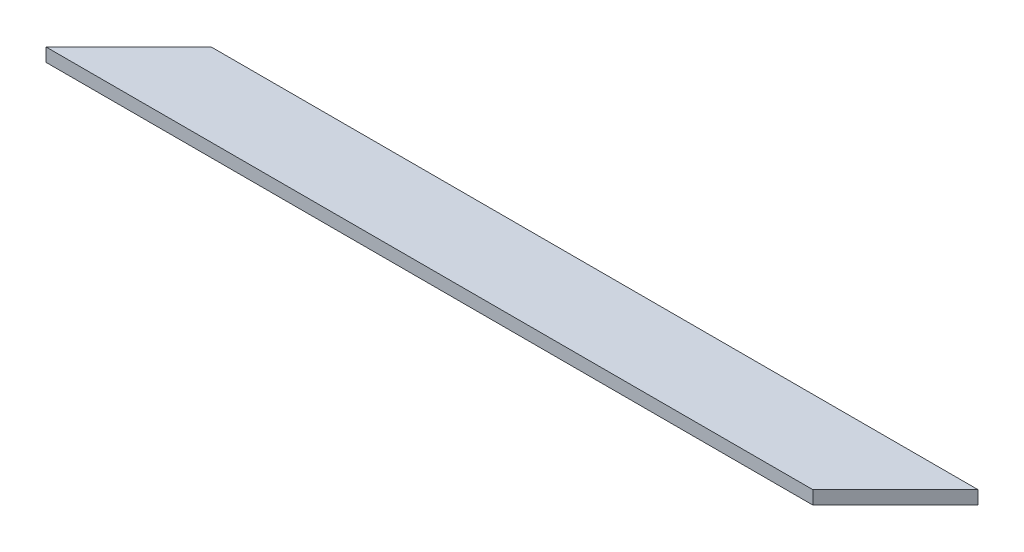
ISO-10303-21;
HEADER;
FILE_DESCRIPTION(('STEP AP214'),'2;1');
FILE_NAME('part.step','',(''),(''),'','','');
FILE_SCHEMA(('AUTOMOTIVE_DESIGN { 1 0 10303 214 1 1 1 1 }'));
ENDSEC;
DATA;
#1=APPLICATION_CONTEXT('core data for automotive mechanical design processes');
#2=APPLICATION_PROTOCOL_DEFINITION('international standard','automotive_design',2000,#1);
#3=PRODUCT_CONTEXT('',#1,'mechanical');
#4=PRODUCT('Part','Part','',(#3));
#5=PRODUCT_RELATED_PRODUCT_CATEGORY('part','',(#4));
#6=PRODUCT_DEFINITION_FORMATION('','',#4);
#7=PRODUCT_DEFINITION_CONTEXT('part definition',#1,'design');
#8=PRODUCT_DEFINITION('design','',#6,#7);
#9=PRODUCT_DEFINITION_SHAPE('','',#8);
#10=(LENGTH_UNIT() NAMED_UNIT(*) SI_UNIT(.MILLI.,.METRE.));
#11=(NAMED_UNIT(*) PLANE_ANGLE_UNIT() SI_UNIT($,.RADIAN.));
#12=(NAMED_UNIT(*) SI_UNIT($,.STERADIAN.) SOLID_ANGLE_UNIT());
#13=UNCERTAINTY_MEASURE_WITH_UNIT(LENGTH_MEASURE(1.E-05),#10,'distance_accuracy_value','');
#14=(GEOMETRIC_REPRESENTATION_CONTEXT(3) GLOBAL_UNCERTAINTY_ASSIGNED_CONTEXT((#13)) GLOBAL_UNIT_ASSIGNED_CONTEXT((#10,
#11,#12)) REPRESENTATION_CONTEXT('',''));
#15=CARTESIAN_POINT('',(0.,0.,0.));
#16=DIRECTION('',(0.,0.,1.));
#17=DIRECTION('',(1.,0.,0.));
#18=AXIS2_PLACEMENT_3D('',#15,#16,#17);
#19=CARTESIAN_POINT('',(-6750.84375,21.59,-2176.4625));
#20=DIRECTION('',(-0.707106781186548,0.,-0.707106781186548));
#21=DIRECTION('',(-0.707106781186548,0.,0.707106781186548));
#22=AXIS2_PLACEMENT_3D('',#19,#20,#21);
#23=PLANE('',#22);
#24=DIRECTION('',(0.707106781186548,0.,-0.707106781186548));
#25=VECTOR('',#24,1.);
#26=CARTESIAN_POINT('',(-6750.84375,0.,-2176.4625));
#27=LINE('',#26,#25);
#28=CARTESIAN_POINT('',(-6750.84375,0.,-2176.4625));
#29=VERTEX_POINT('',#28);
#30=CARTESIAN_POINT('',(-6617.49375,0.,-2309.8125));
#31=VERTEX_POINT('',#30);
#32=EDGE_CURVE('E98',#29,#31,#27,.T.);
#33=ORIENTED_EDGE('',*,*,#32,.F.);
#34=DIRECTION('',(0.,-1.,0.));
#35=VECTOR('',#34,1.);
#36=CARTESIAN_POINT('',(-6750.84375,21.59,-2176.4625));
#37=LINE('',#36,#35);
#38=CARTESIAN_POINT('',(-6750.84375,21.59,-2176.4625));
#39=VERTEX_POINT('',#38);
#40=EDGE_CURVE('E11',#39,#29,#37,.T.);
#41=ORIENTED_EDGE('',*,*,#40,.F.);
#42=DIRECTION('',(0.707106781186548,0.,-0.707106781186548));
#43=VECTOR('',#42,1.);
#44=CARTESIAN_POINT('',(-6750.84375,21.59,-2176.4625));
#45=LINE('',#44,#43);
#46=CARTESIAN_POINT('',(-6617.49375,21.59,-2309.8125));
#47=VERTEX_POINT('',#46);
#48=EDGE_CURVE('E92',#39,#47,#45,.T.);
#49=ORIENTED_EDGE('',*,*,#48,.T.);
#50=DIRECTION('',(0.,-1.,0.));
#51=VECTOR('',#50,1.);
#52=CARTESIAN_POINT('',(-6617.49375,21.59,-2309.8125));
#53=LINE('',#52,#51);
#54=EDGE_CURVE('E36',#47,#31,#53,.T.);
#55=ORIENTED_EDGE('',*,*,#54,.T.);
#56=EDGE_LOOP('',(#33,#41,#49,#55));
#57=FACE_BOUND('',#56,.T.);
#58=ADVANCED_FACE('F33',(#57),#23,.T.);
#59=CARTESIAN_POINT('',(-6750.84375,21.59,-2176.4625));
#60=DIRECTION('',(0.,0.,-1.));
#61=DIRECTION('',(-1.,0.,0.));
#62=AXIS2_PLACEMENT_3D('',#59,#60,#61);
#63=PLANE('',#62);
#64=DIRECTION('',(1.,0.,0.));
#65=VECTOR('',#64,1.);
#66=CARTESIAN_POINT('',(-6750.84375,0.,-2176.4625));
#67=LINE('',#66,#65);
#68=CARTESIAN_POINT('',(-5512.59375,0.,-2176.4625));
#69=VERTEX_POINT('',#68);
#70=EDGE_CURVE('E94',#29,#69,#67,.T.);
#71=ORIENTED_EDGE('',*,*,#70,.T.);
#72=DIRECTION('',(0.,-1.,0.));
#73=VECTOR('',#72,1.);
#74=CARTESIAN_POINT('',(-5512.59375,21.59,-2176.4625));
#75=LINE('',#74,#73);
#76=CARTESIAN_POINT('',(-5512.59375,21.59,-2176.4625));
#77=VERTEX_POINT('',#76);
#78=EDGE_CURVE('E42',#77,#69,#75,.T.);
#79=ORIENTED_EDGE('',*,*,#78,.F.);
#80=DIRECTION('',(1.,0.,0.));
#81=VECTOR('',#80,1.);
#82=CARTESIAN_POINT('',(-6750.84375,21.59,-2176.4625));
#83=LINE('',#82,#81);
#84=EDGE_CURVE('E89',#39,#77,#83,.T.);
#85=ORIENTED_EDGE('',*,*,#84,.F.);
#86=ORIENTED_EDGE('',*,*,#40,.T.);
#87=EDGE_LOOP('',(#71,#79,#85,#86));
#88=FACE_BOUND('',#87,.T.);
#89=ADVANCED_FACE('F105',(#88),#63,.F.);
#90=CARTESIAN_POINT('',(-5379.24375,21.59,-2309.8125));
#91=DIRECTION('',(0.707106781186548,0.,0.707106781186548));
#92=DIRECTION('',(0.707106781186548,0.,-0.707106781186548));
#93=AXIS2_PLACEMENT_3D('',#90,#91,#92);
#94=PLANE('',#93);
#95=DIRECTION('',(-0.707106781186548,0.,0.707106781186548));
#96=VECTOR('',#95,1.);
#97=CARTESIAN_POINT('',(-5379.24375,0.,-2309.8125));
#98=LINE('',#97,#96);
#99=CARTESIAN_POINT('',(-5379.24375,0.,-2309.8125));
#100=VERTEX_POINT('',#99);
#101=EDGE_CURVE('E83',#100,#69,#98,.T.);
#102=ORIENTED_EDGE('',*,*,#101,.F.);
#103=DIRECTION('',(0.,-1.,0.));
#104=VECTOR('',#103,1.);
#105=CARTESIAN_POINT('',(-5379.24375,21.59,-2309.8125));
#106=LINE('',#105,#104);
#107=CARTESIAN_POINT('',(-5379.24375,21.59,-2309.8125));
#108=VERTEX_POINT('',#107);
#109=EDGE_CURVE('E78',#108,#100,#106,.T.);
#110=ORIENTED_EDGE('',*,*,#109,.F.);
#111=DIRECTION('',(-0.707106781186548,0.,0.707106781186548));
#112=VECTOR('',#111,1.);
#113=CARTESIAN_POINT('',(-5379.24375,21.59,-2309.8125));
#114=LINE('',#113,#112);
#115=EDGE_CURVE('E81',#108,#77,#114,.T.);
#116=ORIENTED_EDGE('',*,*,#115,.T.);
#117=ORIENTED_EDGE('',*,*,#78,.T.);
#118=EDGE_LOOP('',(#102,#110,#116,#117));
#119=FACE_BOUND('',#118,.T.);
#120=ADVANCED_FACE('F80',(#119),#94,.T.);
#121=CARTESIAN_POINT('',(-6617.49375,21.59,-2309.8125));
#122=DIRECTION('',(0.,0.,-1.));
#123=DIRECTION('',(-1.,0.,0.));
#124=AXIS2_PLACEMENT_3D('',#121,#122,#123);
#125=PLANE('',#124);
#126=DIRECTION('',(1.,0.,0.));
#127=VECTOR('',#126,1.);
#128=CARTESIAN_POINT('',(-6617.49375,0.,-2309.8125));
#129=LINE('',#128,#127);
#130=EDGE_CURVE('E101',#31,#100,#129,.T.);
#131=ORIENTED_EDGE('',*,*,#130,.F.);
#132=ORIENTED_EDGE('',*,*,#54,.F.);
#133=DIRECTION('',(1.,0.,0.));
#134=VECTOR('',#133,1.);
#135=CARTESIAN_POINT('',(-6617.49375,21.59,-2309.8125));
#136=LINE('',#135,#134);
#137=EDGE_CURVE('E88',#47,#108,#136,.T.);
#138=ORIENTED_EDGE('',*,*,#137,.T.);
#139=ORIENTED_EDGE('',*,*,#109,.T.);
#140=EDGE_LOOP('',(#131,#132,#138,#139));
#141=FACE_BOUND('',#140,.T.);
#142=ADVANCED_FACE('F91',(#141),#125,.T.);
#143=CARTESIAN_POINT('',(0.,21.59,0.));
#144=DIRECTION('',(0.,-1.,0.));
#145=DIRECTION('',(0.,0.,-1.));
#146=AXIS2_PLACEMENT_3D('',#143,#144,#145);
#147=PLANE('',#146);
#148=ORIENTED_EDGE('',*,*,#48,.F.);
#149=ORIENTED_EDGE('',*,*,#84,.T.);
#150=ORIENTED_EDGE('',*,*,#115,.F.);
#151=ORIENTED_EDGE('',*,*,#137,.F.);
#152=EDGE_LOOP('',(#148,#149,#150,#151));
#153=FACE_BOUND('',#152,.T.);
#154=ADVANCED_FACE('F87',(#153),#147,.F.);
#155=CARTESIAN_POINT('',(0.,0.,0.));
#156=DIRECTION('',(0.,-1.,0.));
#157=DIRECTION('',(0.,0.,-1.));
#158=AXIS2_PLACEMENT_3D('',#155,#156,#157);
#159=PLANE('',#158);
#160=ORIENTED_EDGE('',*,*,#32,.T.);
#161=ORIENTED_EDGE('',*,*,#130,.T.);
#162=ORIENTED_EDGE('',*,*,#101,.T.);
#163=ORIENTED_EDGE('',*,*,#70,.F.);
#164=EDGE_LOOP('',(#160,#161,#162,#163));
#165=FACE_BOUND('',#164,.T.);
#166=ADVANCED_FACE('F107',(#165),#159,.T.);
#167=CLOSED_SHELL('',(#58,#89,#120,#142,#154,#166));
#168=MANIFOLD_SOLID_BREP('B2',#167);
#169=ADVANCED_BREP_SHAPE_REPRESENTATION('',(#18,#168),#14);
#170=SHAPE_DEFINITION_REPRESENTATION(#9,#169);
ENDSEC;
END-ISO-10303-21;
